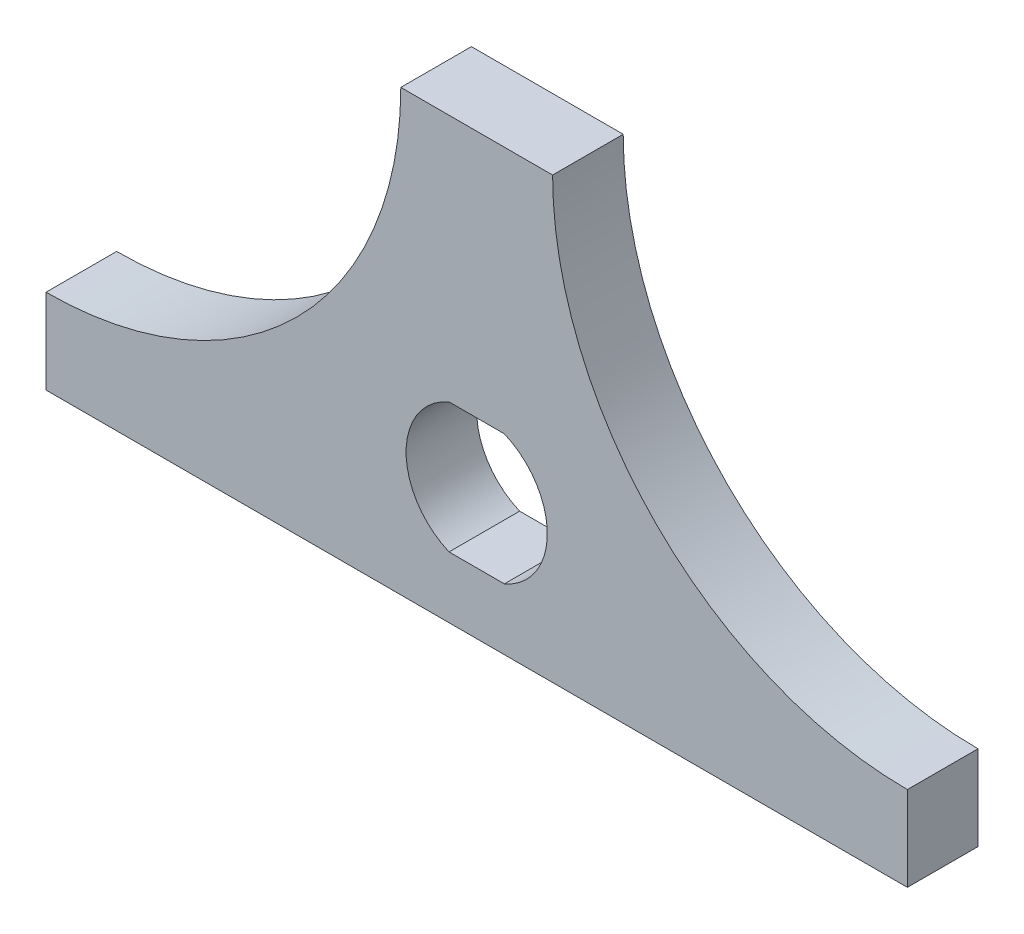
ISO-10303-21;
HEADER;
FILE_DESCRIPTION(('STEP AP214'),'2;1');
FILE_NAME('part.step','',(''),(''),'','','');
FILE_SCHEMA(('AUTOMOTIVE_DESIGN { 1 0 10303 214 1 1 1 1 }'));
ENDSEC;
DATA;
#1=APPLICATION_CONTEXT('core data for automotive mechanical design processes');
#2=APPLICATION_PROTOCOL_DEFINITION('international standard','automotive_design',2000,#1);
#3=PRODUCT_CONTEXT('',#1,'mechanical');
#4=PRODUCT('Part','Part','',(#3));
#5=PRODUCT_RELATED_PRODUCT_CATEGORY('part','',(#4));
#6=PRODUCT_DEFINITION_FORMATION('','',#4);
#7=PRODUCT_DEFINITION_CONTEXT('part definition',#1,'design');
#8=PRODUCT_DEFINITION('design','',#6,#7);
#9=PRODUCT_DEFINITION_SHAPE('','',#8);
#10=(LENGTH_UNIT() NAMED_UNIT(*) SI_UNIT(.MILLI.,.METRE.));
#11=(NAMED_UNIT(*) PLANE_ANGLE_UNIT() SI_UNIT($,.RADIAN.));
#12=(NAMED_UNIT(*) SI_UNIT($,.STERADIAN.) SOLID_ANGLE_UNIT());
#13=UNCERTAINTY_MEASURE_WITH_UNIT(LENGTH_MEASURE(1.E-05),#10,'distance_accuracy_value','');
#14=(GEOMETRIC_REPRESENTATION_CONTEXT(3) GLOBAL_UNCERTAINTY_ASSIGNED_CONTEXT((#13)) GLOBAL_UNIT_ASSIGNED_CONTEXT((#10,
#11,#12)) REPRESENTATION_CONTEXT('',''));
#15=CARTESIAN_POINT('',(0.,0.,0.));
#16=DIRECTION('',(0.,0.,1.));
#17=DIRECTION('',(1.,0.,0.));
#18=AXIS2_PLACEMENT_3D('',#15,#16,#17);
#19=CARTESIAN_POINT('',(0.,0.,0.));
#20=DIRECTION('',(0.,0.,1.));
#21=DIRECTION('',(1.,0.,0.));
#22=AXIS2_PLACEMENT_3D('',#19,#20,#21);
#23=CYLINDRICAL_SURFACE('',#22,6.35);
#24=DIRECTION('',(0.,0.,1.));
#25=VECTOR('',#24,1.);
#26=CARTESIAN_POINT('',(-2.48868157866771,-5.842,-5.1368320977038));
#27=LINE('',#26,#25);
#28=CARTESIAN_POINT('',(-2.48868157866771,-5.842,0.));
#29=VERTEX_POINT('',#28);
#30=CARTESIAN_POINT('',(-2.48868157866771,-5.842,6.35));
#31=VERTEX_POINT('',#30);
#32=EDGE_CURVE('E113',#29,#31,#27,.T.);
#33=ORIENTED_EDGE('',*,*,#32,.F.);
#34=CARTESIAN_POINT('',(0.,0.,0.));
#35=DIRECTION('',(0.,0.,1.));
#36=DIRECTION('',(1.,0.,0.));
#37=AXIS2_PLACEMENT_3D('',#34,#35,#36);
#38=CIRCLE('',#37,6.35);
#39=CARTESIAN_POINT('',(-2.48868157866771,5.842,0.));
#40=VERTEX_POINT('',#39);
#41=EDGE_CURVE('E12',#40,#29,#38,.T.);
#42=ORIENTED_EDGE('',*,*,#41,.F.);
#43=DIRECTION('',(0.,0.,1.));
#44=VECTOR('',#43,1.);
#45=CARTESIAN_POINT('',(-2.48868157866771,5.842,-5.1368320977038));
#46=LINE('',#45,#44);
#47=CARTESIAN_POINT('',(-2.48868157866771,5.842,6.35));
#48=VERTEX_POINT('',#47);
#49=EDGE_CURVE('E131',#40,#48,#46,.T.);
#50=ORIENTED_EDGE('',*,*,#49,.T.);
#51=CARTESIAN_POINT('',(0.,0.,6.35));
#52=DIRECTION('',(0.,0.,1.));
#53=DIRECTION('',(1.,0.,0.));
#54=AXIS2_PLACEMENT_3D('',#51,#52,#53);
#55=CIRCLE('',#54,6.35);
#56=EDGE_CURVE('E38',#48,#31,#55,.T.);
#57=ORIENTED_EDGE('',*,*,#56,.T.);
#58=EDGE_LOOP('',(#33,#42,#50,#57));
#59=FACE_BOUND('',#58,.T.);
#60=ADVANCED_FACE('F34',(#59),#23,.F.);
#61=DIRECTION('',(0.,0.,1.));
#62=VECTOR('',#61,1.);
#63=CARTESIAN_POINT('',(2.48868157866771,-5.842,-5.1368320977038));
#64=LINE('',#63,#62);
#65=CARTESIAN_POINT('',(2.48868157866771,-5.842,0.));
#66=VERTEX_POINT('',#65);
#67=CARTESIAN_POINT('',(2.48868157866771,-5.842,6.35));
#68=VERTEX_POINT('',#67);
#69=EDGE_CURVE('E116',#66,#68,#64,.T.);
#70=ORIENTED_EDGE('',*,*,#69,.T.);
#71=CARTESIAN_POINT('',(2.48868157866771,5.842,6.35));
#72=VERTEX_POINT('',#71);
#73=EDGE_CURVE('E174',#68,#72,#55,.T.);
#74=ORIENTED_EDGE('',*,*,#73,.T.);
#75=DIRECTION('',(0.,0.,1.));
#76=VECTOR('',#75,1.);
#77=CARTESIAN_POINT('',(2.48868157866771,5.842,-5.1368320977038));
#78=LINE('',#77,#76);
#79=CARTESIAN_POINT('',(2.48868157866771,5.842,0.));
#80=VERTEX_POINT('',#79);
#81=EDGE_CURVE('E129',#80,#72,#78,.T.);
#82=ORIENTED_EDGE('',*,*,#81,.F.);
#83=EDGE_CURVE('E43',#66,#80,#38,.T.);
#84=ORIENTED_EDGE('',*,*,#83,.F.);
#85=EDGE_LOOP('',(#70,#74,#82,#84));
#86=FACE_BOUND('',#85,.T.);
#87=ADVANCED_FACE('F219',(#86),#23,.F.);
#88=CARTESIAN_POINT('',(0.,0.,6.35));
#89=DIRECTION('',(0.,0.,-1.));
#90=DIRECTION('',(-1.,0.,0.));
#91=AXIS2_PLACEMENT_3D('',#88,#89,#90);
#92=PLANE('',#91);
#93=ORIENTED_EDGE('',*,*,#73,.F.);
#94=DIRECTION('',(1.,0.,0.));
#95=VECTOR('',#94,1.);
#96=CARTESIAN_POINT('',(-2.48868157866771,-5.842,6.35));
#97=LINE('',#96,#95);
#98=EDGE_CURVE('E123',#31,#68,#97,.T.);
#99=ORIENTED_EDGE('',*,*,#98,.F.);
#100=ORIENTED_EDGE('',*,*,#56,.F.);
#101=DIRECTION('',(1.,0.,0.));
#102=VECTOR('',#101,1.);
#103=CARTESIAN_POINT('',(-2.48868157866771,5.842,6.35));
#104=LINE('',#103,#102);
#105=EDGE_CURVE('E57',#48,#72,#104,.T.);
#106=ORIENTED_EDGE('',*,*,#105,.T.);
#107=EDGE_LOOP('',(#93,#99,#100,#106));
#108=FACE_BOUND('',#107,.T.);
#109=DIRECTION('',(0.,1.,0.));
#110=VECTOR('',#109,1.);
#111=CARTESIAN_POINT('',(38.7350000000007,-11.3588130866719,6.35));
#112=LINE('',#111,#110);
#113=CARTESIAN_POINT('',(38.7350000000007,-11.3588130866719,6.35));
#114=VERTEX_POINT('',#113);
#115=CARTESIAN_POINT('',(38.7350000000007,-3.73881308667278,6.35));
#116=VERTEX_POINT('',#115);
#117=EDGE_CURVE('E133',#114,#116,#112,.T.);
#118=ORIENTED_EDGE('',*,*,#117,.T.);
#119=CARTESIAN_POINT('',(38.7350000000007,28.1699369133272,6.35));
#120=DIRECTION('',(0.,0.,-1.));
#121=DIRECTION('',(1.,0.,0.));
#122=AXIS2_PLACEMENT_3D('',#119,#120,#121);
#123=CIRCLE('',#122,31.90875);
#124=CARTESIAN_POINT('',(6.82625000000069,28.1699369133272,6.35));
#125=VERTEX_POINT('',#124);
#126=EDGE_CURVE('E136',#116,#125,#123,.T.);
#127=ORIENTED_EDGE('',*,*,#126,.T.);
#128=DIRECTION('',(-1.,0.,0.));
#129=VECTOR('',#128,1.);
#130=CARTESIAN_POINT('',(-6.82625000000034,28.1699369133281,6.35));
#131=LINE('',#130,#129);
#132=CARTESIAN_POINT('',(-6.82625000000034,28.1699369133281,6.35));
#133=VERTEX_POINT('',#132);
#134=EDGE_CURVE('E161',#125,#133,#131,.T.);
#135=ORIENTED_EDGE('',*,*,#134,.T.);
#136=CARTESIAN_POINT('',(-38.7350000000003,28.1699369133281,6.35));
#137=DIRECTION('',(0.,0.,-1.));
#138=DIRECTION('',(-1.,0.,0.));
#139=AXIS2_PLACEMENT_3D('',#136,#137,#138);
#140=CIRCLE('',#139,31.90875);
#141=CARTESIAN_POINT('',(-38.7350000000003,-3.73881308667187,6.35));
#142=VERTEX_POINT('',#141);
#143=EDGE_CURVE('E164',#133,#142,#140,.T.);
#144=ORIENTED_EDGE('',*,*,#143,.T.);
#145=DIRECTION('',(0.,-1.,0.));
#146=VECTOR('',#145,1.);
#147=CARTESIAN_POINT('',(-38.7350000000003,-3.73881308667187,6.35));
#148=LINE('',#147,#146);
#149=CARTESIAN_POINT('',(-38.7350000000003,-11.3588130866719,6.35));
#150=VERTEX_POINT('',#149);
#151=EDGE_CURVE('E167',#142,#150,#148,.T.);
#152=ORIENTED_EDGE('',*,*,#151,.T.);
#153=DIRECTION('',(1.,0.,0.));
#154=VECTOR('',#153,1.);
#155=CARTESIAN_POINT('',(-38.7350000000003,-11.3588130866719,6.35));
#156=LINE('',#155,#154);
#157=EDGE_CURVE('E143',#150,#114,#156,.T.);
#158=ORIENTED_EDGE('',*,*,#157,.T.);
#159=EDGE_LOOP('',(#118,#127,#135,#144,#152,#158));
#160=FACE_BOUND('',#159,.T.);
#161=ADVANCED_FACE('F194',(#108,#160),#92,.F.);
#162=CARTESIAN_POINT('',(0.,0.,0.));
#163=DIRECTION('',(0.,0.,-1.));
#164=DIRECTION('',(-1.,0.,0.));
#165=AXIS2_PLACEMENT_3D('',#162,#163,#164);
#166=PLANE('',#165);
#167=DIRECTION('',(1.,0.,0.));
#168=VECTOR('',#167,1.);
#169=CARTESIAN_POINT('',(-2.48868157866771,-5.842,0.));
#170=LINE('',#169,#168);
#171=EDGE_CURVE('E49',#29,#66,#170,.T.);
#172=ORIENTED_EDGE('',*,*,#171,.T.);
#173=ORIENTED_EDGE('',*,*,#83,.T.);
#174=DIRECTION('',(1.,0.,0.));
#175=VECTOR('',#174,1.);
#176=CARTESIAN_POINT('',(-2.48868157866771,5.842,0.));
#177=LINE('',#176,#175);
#178=EDGE_CURVE('E127',#40,#80,#177,.T.);
#179=ORIENTED_EDGE('',*,*,#178,.F.);
#180=ORIENTED_EDGE('',*,*,#41,.T.);
#181=EDGE_LOOP('',(#172,#173,#179,#180));
#182=FACE_BOUND('',#181,.T.);
#183=CARTESIAN_POINT('',(38.7350000000007,28.1699369133272,0.));
#184=DIRECTION('',(0.,0.,-1.));
#185=DIRECTION('',(1.,0.,0.));
#186=AXIS2_PLACEMENT_3D('',#183,#184,#185);
#187=CIRCLE('',#186,31.90875);
#188=CARTESIAN_POINT('',(38.7350000000007,-3.73881308667278,0.));
#189=VERTEX_POINT('',#188);
#190=CARTESIAN_POINT('',(6.82625000000069,28.1699369133272,0.));
#191=VERTEX_POINT('',#190);
#192=EDGE_CURVE('E142',#189,#191,#187,.T.);
#193=ORIENTED_EDGE('',*,*,#192,.F.);
#194=DIRECTION('',(0.,1.,0.));
#195=VECTOR('',#194,1.);
#196=CARTESIAN_POINT('',(38.7350000000007,-11.3588130866719,0.));
#197=LINE('',#196,#195);
#198=CARTESIAN_POINT('',(38.7350000000007,-11.3588130866719,0.));
#199=VERTEX_POINT('',#198);
#200=EDGE_CURVE('E140',#199,#189,#197,.T.);
#201=ORIENTED_EDGE('',*,*,#200,.F.);
#202=DIRECTION('',(1.,0.,0.));
#203=VECTOR('',#202,1.);
#204=CARTESIAN_POINT('',(-38.7350000000003,-11.3588130866719,0.));
#205=LINE('',#204,#203);
#206=CARTESIAN_POINT('',(-38.7350000000003,-11.3588130866719,0.));
#207=VERTEX_POINT('',#206);
#208=EDGE_CURVE('E155',#207,#199,#205,.T.);
#209=ORIENTED_EDGE('',*,*,#208,.F.);
#210=DIRECTION('',(0.,-1.,0.));
#211=VECTOR('',#210,1.);
#212=CARTESIAN_POINT('',(-38.7350000000003,-3.73881308667187,0.));
#213=LINE('',#212,#211);
#214=CARTESIAN_POINT('',(-38.7350000000003,-3.73881308667187,0.));
#215=VERTEX_POINT('',#214);
#216=EDGE_CURVE('E152',#215,#207,#213,.T.);
#217=ORIENTED_EDGE('',*,*,#216,.F.);
#218=CARTESIAN_POINT('',(-38.7350000000003,28.1699369133281,0.));
#219=DIRECTION('',(0.,0.,-1.));
#220=DIRECTION('',(-1.,0.,0.));
#221=AXIS2_PLACEMENT_3D('',#218,#219,#220);
#222=CIRCLE('',#221,31.90875);
#223=CARTESIAN_POINT('',(-6.82625000000034,28.1699369133281,0.));
#224=VERTEX_POINT('',#223);
#225=EDGE_CURVE('E149',#224,#215,#222,.T.);
#226=ORIENTED_EDGE('',*,*,#225,.F.);
#227=DIRECTION('',(-1.,0.,0.));
#228=VECTOR('',#227,1.);
#229=CARTESIAN_POINT('',(-6.82625000000034,28.1699369133281,0.));
#230=LINE('',#229,#228);
#231=EDGE_CURVE('E146',#191,#224,#230,.T.);
#232=ORIENTED_EDGE('',*,*,#231,.F.);
#233=EDGE_LOOP('',(#193,#201,#209,#217,#226,#232));
#234=FACE_BOUND('',#233,.T.);
#235=ADVANCED_FACE('F36',(#182,#234),#166,.T.);
#236=CARTESIAN_POINT('',(38.7350000000007,-11.3588130866719,0.));
#237=DIRECTION('',(1.,0.,0.));
#238=DIRECTION('',(0.,1.,0.));
#239=AXIS2_PLACEMENT_3D('',#236,#237,#238);
#240=PLANE('',#239);
#241=ORIENTED_EDGE('',*,*,#117,.F.);
#242=DIRECTION('',(0.,0.,1.));
#243=VECTOR('',#242,1.);
#244=CARTESIAN_POINT('',(38.7350000000007,-11.3588130866719,0.));
#245=LINE('',#244,#243);
#246=EDGE_CURVE('E172',#199,#114,#245,.T.);
#247=ORIENTED_EDGE('',*,*,#246,.F.);
#248=ORIENTED_EDGE('',*,*,#200,.T.);
#249=DIRECTION('',(0.,0.,1.));
#250=VECTOR('',#249,1.);
#251=CARTESIAN_POINT('',(38.7350000000007,-3.73881308667278,0.));
#252=LINE('',#251,#250);
#253=EDGE_CURVE('E157',#189,#116,#252,.T.);
#254=ORIENTED_EDGE('',*,*,#253,.T.);
#255=EDGE_LOOP('',(#241,#247,#248,#254));
#256=FACE_BOUND('',#255,.T.);
#257=ADVANCED_FACE('F188',(#256),#240,.T.);
#258=CARTESIAN_POINT('',(-38.7350000000003,-11.3588130866719,0.));
#259=DIRECTION('',(0.,-1.,0.));
#260=DIRECTION('',(0.,0.,-1.));
#261=AXIS2_PLACEMENT_3D('',#258,#259,#260);
#262=PLANE('',#261);
#263=ORIENTED_EDGE('',*,*,#157,.F.);
#264=DIRECTION('',(0.,0.,1.));
#265=VECTOR('',#264,1.);
#266=CARTESIAN_POINT('',(-38.7350000000003,-11.3588130866719,0.));
#267=LINE('',#266,#265);
#268=EDGE_CURVE('E175',#207,#150,#267,.T.);
#269=ORIENTED_EDGE('',*,*,#268,.F.);
#270=ORIENTED_EDGE('',*,*,#208,.T.);
#271=ORIENTED_EDGE('',*,*,#246,.T.);
#272=EDGE_LOOP('',(#263,#269,#270,#271));
#273=FACE_BOUND('',#272,.T.);
#274=ADVANCED_FACE('F198',(#273),#262,.T.);
#275=CARTESIAN_POINT('',(-38.7350000000003,-3.73881308667187,0.));
#276=DIRECTION('',(-1.,0.,0.));
#277=DIRECTION('',(0.,-1.,0.));
#278=AXIS2_PLACEMENT_3D('',#275,#276,#277);
#279=PLANE('',#278);
#280=ORIENTED_EDGE('',*,*,#151,.F.);
#281=DIRECTION('',(0.,0.,1.));
#282=VECTOR('',#281,1.);
#283=CARTESIAN_POINT('',(-38.7350000000003,-3.73881308667187,0.));
#284=LINE('',#283,#282);
#285=EDGE_CURVE('E177',#215,#142,#284,.T.);
#286=ORIENTED_EDGE('',*,*,#285,.F.);
#287=ORIENTED_EDGE('',*,*,#216,.T.);
#288=ORIENTED_EDGE('',*,*,#268,.T.);
#289=EDGE_LOOP('',(#280,#286,#287,#288));
#290=FACE_BOUND('',#289,.T.);
#291=ADVANCED_FACE('F209',(#290),#279,.T.);
#292=CARTESIAN_POINT('',(-38.7350000000003,28.1699369133281,0.));
#293=DIRECTION('',(0.,0.,1.));
#294=DIRECTION('',(1.,0.,0.));
#295=AXIS2_PLACEMENT_3D('',#292,#293,#294);
#296=CYLINDRICAL_SURFACE('',#295,31.90875);
#297=ORIENTED_EDGE('',*,*,#143,.F.);
#298=DIRECTION('',(0.,0.,1.));
#299=VECTOR('',#298,1.);
#300=CARTESIAN_POINT('',(-6.82625000000034,28.1699369133281,0.));
#301=LINE('',#300,#299);
#302=EDGE_CURVE('E179',#224,#133,#301,.T.);
#303=ORIENTED_EDGE('',*,*,#302,.F.);
#304=ORIENTED_EDGE('',*,*,#225,.T.);
#305=ORIENTED_EDGE('',*,*,#285,.T.);
#306=EDGE_LOOP('',(#297,#303,#304,#305));
#307=FACE_BOUND('',#306,.T.);
#308=ADVANCED_FACE('F207',(#307),#296,.F.);
#309=CARTESIAN_POINT('',(-6.82625000000034,28.1699369133281,0.));
#310=DIRECTION('',(0.,1.,0.));
#311=DIRECTION('',(-1.,0.,0.));
#312=AXIS2_PLACEMENT_3D('',#309,#310,#311);
#313=PLANE('',#312);
#314=ORIENTED_EDGE('',*,*,#134,.F.);
#315=DIRECTION('',(0.,0.,1.));
#316=VECTOR('',#315,1.);
#317=CARTESIAN_POINT('',(6.82625000000069,28.1699369133272,0.));
#318=LINE('',#317,#316);
#319=EDGE_CURVE('E181',#191,#125,#318,.T.);
#320=ORIENTED_EDGE('',*,*,#319,.F.);
#321=ORIENTED_EDGE('',*,*,#231,.T.);
#322=ORIENTED_EDGE('',*,*,#302,.T.);
#323=EDGE_LOOP('',(#314,#320,#321,#322));
#324=FACE_BOUND('',#323,.T.);
#325=ADVANCED_FACE('F204',(#324),#313,.T.);
#326=CARTESIAN_POINT('',(38.7350000000007,28.1699369133272,0.));
#327=DIRECTION('',(0.,0.,1.));
#328=DIRECTION('',(1.,0.,0.));
#329=AXIS2_PLACEMENT_3D('',#326,#327,#328);
#330=CYLINDRICAL_SURFACE('',#329,31.90875);
#331=ORIENTED_EDGE('',*,*,#126,.F.);
#332=ORIENTED_EDGE('',*,*,#253,.F.);
#333=ORIENTED_EDGE('',*,*,#192,.T.);
#334=ORIENTED_EDGE('',*,*,#319,.T.);
#335=EDGE_LOOP('',(#331,#332,#333,#334));
#336=FACE_BOUND('',#335,.T.);
#337=ADVANCED_FACE('F192',(#336),#330,.F.);
#338=CARTESIAN_POINT('',(-2.48868157866771,5.842,-5.1368320977038));
#339=DIRECTION('',(0.,-1.,0.));
#340=DIRECTION('',(0.,0.,-1.));
#341=AXIS2_PLACEMENT_3D('',#338,#339,#340);
#342=PLANE('',#341);
#343=ORIENTED_EDGE('',*,*,#49,.F.);
#344=ORIENTED_EDGE('',*,*,#178,.T.);
#345=ORIENTED_EDGE('',*,*,#81,.T.);
#346=ORIENTED_EDGE('',*,*,#105,.F.);
#347=EDGE_LOOP('',(#343,#344,#345,#346));
#348=FACE_BOUND('',#347,.T.);
#349=ADVANCED_FACE('F132',(#348),#342,.T.);
#350=CARTESIAN_POINT('',(-2.48868157866771,-5.842,-5.1368320977038));
#351=DIRECTION('',(0.,-1.,0.));
#352=DIRECTION('',(0.,0.,-1.));
#353=AXIS2_PLACEMENT_3D('',#350,#351,#352);
#354=PLANE('',#353);
#355=ORIENTED_EDGE('',*,*,#171,.F.);
#356=ORIENTED_EDGE('',*,*,#32,.T.);
#357=ORIENTED_EDGE('',*,*,#98,.T.);
#358=ORIENTED_EDGE('',*,*,#69,.F.);
#359=EDGE_LOOP('',(#355,#356,#357,#358));
#360=FACE_BOUND('',#359,.T.);
#361=ADVANCED_FACE('F112',(#360),#354,.F.);
#362=CLOSED_SHELL('',(#60,#87,#161,#235,#257,#274,#291,#308,#325,#337,#349,#361));
#363=MANIFOLD_SOLID_BREP('B2',#362);
#364=ADVANCED_BREP_SHAPE_REPRESENTATION('',(#18,#363),#14);
#365=SHAPE_DEFINITION_REPRESENTATION(#9,#364);
ENDSEC;
END-ISO-10303-21;
